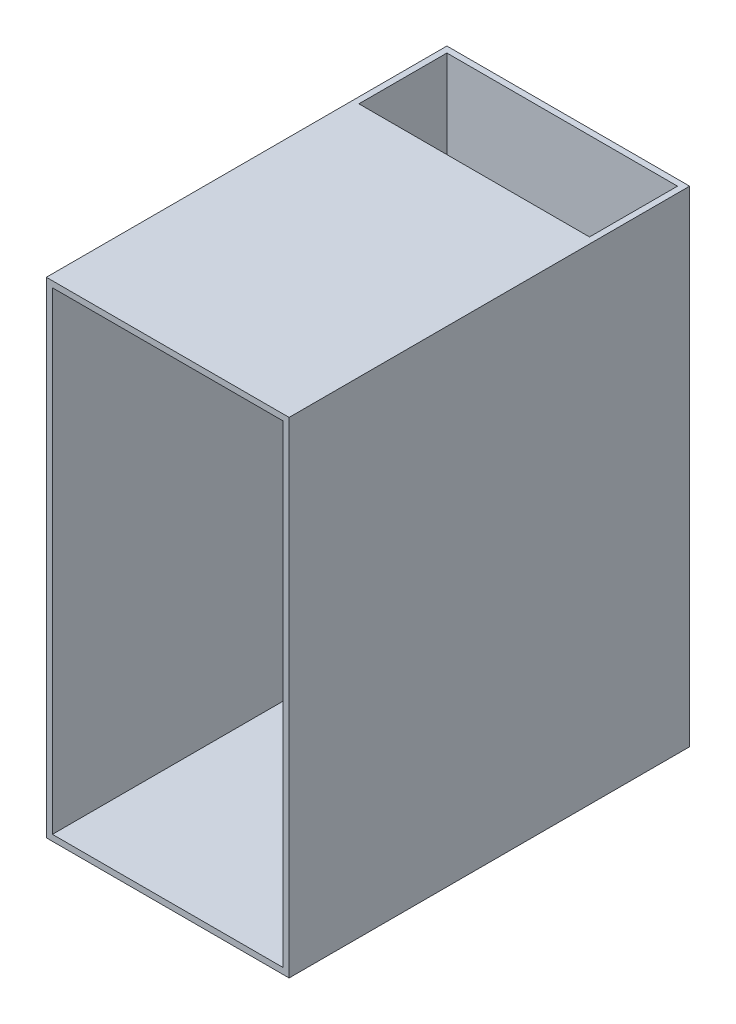
ISO-10303-21;
HEADER;
FILE_DESCRIPTION(('STEP AP214'),'2;1');
FILE_NAME('part.step','',(''),(''),'','','');
FILE_SCHEMA(('AUTOMOTIVE_DESIGN { 1 0 10303 214 1 1 1 1 }'));
ENDSEC;
DATA;
#1=APPLICATION_CONTEXT('core data for automotive mechanical design processes');
#2=APPLICATION_PROTOCOL_DEFINITION('international standard','automotive_design',2000,#1);
#3=PRODUCT_CONTEXT('',#1,'mechanical');
#4=PRODUCT('Part','Part','',(#3));
#5=PRODUCT_RELATED_PRODUCT_CATEGORY('part','',(#4));
#6=PRODUCT_DEFINITION_FORMATION('','',#4);
#7=PRODUCT_DEFINITION_CONTEXT('part definition',#1,'design');
#8=PRODUCT_DEFINITION('design','',#6,#7);
#9=PRODUCT_DEFINITION_SHAPE('','',#8);
#10=(LENGTH_UNIT() NAMED_UNIT(*) SI_UNIT(.MILLI.,.METRE.));
#11=(NAMED_UNIT(*) PLANE_ANGLE_UNIT() SI_UNIT($,.RADIAN.));
#12=(NAMED_UNIT(*) SI_UNIT($,.STERADIAN.) SOLID_ANGLE_UNIT());
#13=UNCERTAINTY_MEASURE_WITH_UNIT(LENGTH_MEASURE(1.E-05),#10,'distance_accuracy_value','');
#14=(GEOMETRIC_REPRESENTATION_CONTEXT(3) GLOBAL_UNCERTAINTY_ASSIGNED_CONTEXT((#13)) GLOBAL_UNIT_ASSIGNED_CONTEXT((#10,
#11,#12)) REPRESENTATION_CONTEXT('',''));
#15=CARTESIAN_POINT('',(0.,0.,0.));
#16=DIRECTION('',(0.,0.,1.));
#17=DIRECTION('',(1.,0.,0.));
#18=AXIS2_PLACEMENT_3D('',#15,#16,#17);
#19=CARTESIAN_POINT('',(38.,78.,132.));
#20=DIRECTION('',(-1.,0.,0.));
#21=DIRECTION('',(0.,0.,1.));
#22=AXIS2_PLACEMENT_3D('',#19,#20,#21);
#23=PLANE('',#22);
#24=DIRECTION('',(0.,-1.,0.));
#25=VECTOR('',#24,1.);
#26=CARTESIAN_POINT('',(38.,-58.,20.));
#27=LINE('',#26,#25);
#28=CARTESIAN_POINT('',(38.,-65.0000000000002,20.));
#29=VERTEX_POINT('',#28);
#30=CARTESIAN_POINT('',(38.,-78.,20.));
#31=VERTEX_POINT('',#30);
#32=EDGE_CURVE('E200',#29,#31,#27,.T.);
#33=ORIENTED_EDGE('',*,*,#32,.F.);
#34=DIRECTION('',(0.,-0.707106781186544,0.707106781186551));
#35=VECTOR('',#34,1.);
#36=CARTESIAN_POINT('',(38.,-58.,12.9999999999997));
#37=LINE('',#36,#35);
#38=CARTESIAN_POINT('',(38.,-72.1453239574458,27.1453239574457));
#39=VERTEX_POINT('',#38);
#40=EDGE_CURVE('E299',#29,#39,#37,.T.);
#41=ORIENTED_EDGE('',*,*,#40,.T.);
#42=CARTESIAN_POINT('',(38.,-79.2163917693113,20.0742561455802));
#43=DIRECTION('',(-1.,0.,0.));
#44=DIRECTION('',(0.,0.,1.));
#45=AXIS2_PLACEMENT_3D('',#42,#43,#44);
#46=CIRCLE('',#45,10.);
#47=CARTESIAN_POINT('',(38.,-78.,30.));
#48=VERTEX_POINT('',#47);
#49=EDGE_CURVE('E11',#39,#48,#46,.F.);
#50=ORIENTED_EDGE('',*,*,#49,.T.);
#51=DIRECTION('',(0.,0.,-1.));
#52=VECTOR('',#51,1.);
#53=CARTESIAN_POINT('',(38.,-78.,132.));
#54=LINE('',#53,#52);
#55=CARTESIAN_POINT('',(38.,-78.,132.));
#56=VERTEX_POINT('',#55);
#57=EDGE_CURVE('E253',#56,#48,#54,.T.);
#58=ORIENTED_EDGE('',*,*,#57,.F.);
#59=DIRECTION('',(0.,1.,0.));
#60=VECTOR('',#59,1.);
#61=CARTESIAN_POINT('',(38.,78.,132.));
#62=LINE('',#61,#60);
#63=CARTESIAN_POINT('',(38.,78.,132.));
#64=VERTEX_POINT('',#63);
#65=EDGE_CURVE('E236',#56,#64,#62,.T.);
#66=ORIENTED_EDGE('',*,*,#65,.T.);
#67=DIRECTION('',(0.,0.,-1.));
#68=VECTOR('',#67,1.);
#69=CARTESIAN_POINT('',(38.,78.,132.));
#70=LINE('',#69,#68);
#71=CARTESIAN_POINT('',(38.,78.,31.));
#72=VERTEX_POINT('',#71);
#73=EDGE_CURVE('E261',#64,#72,#70,.T.);
#74=ORIENTED_EDGE('',*,*,#73,.T.);
#75=DIRECTION('',(0.,1.,0.));
#76=VECTOR('',#75,1.);
#77=CARTESIAN_POINT('',(38.,78.,31.));
#78=LINE('',#77,#76);
#79=CARTESIAN_POINT('',(38.,80.,31.));
#80=VERTEX_POINT('',#79);
#81=EDGE_CURVE('E217',#72,#80,#78,.T.);
#82=ORIENTED_EDGE('',*,*,#81,.T.);
#83=DIRECTION('',(0.,0.,-1.));
#84=VECTOR('',#83,1.);
#85=CARTESIAN_POINT('',(38.,80.,2.00000000000001));
#86=LINE('',#85,#84);
#87=CARTESIAN_POINT('',(38.,80.,2.00000000000001));
#88=VERTEX_POINT('',#87);
#89=EDGE_CURVE('E212',#80,#88,#86,.T.);
#90=ORIENTED_EDGE('',*,*,#89,.T.);
#91=DIRECTION('',(0.,1.,0.));
#92=VECTOR('',#91,1.);
#93=CARTESIAN_POINT('',(38.,78.,2.));
#94=LINE('',#93,#92);
#95=CARTESIAN_POINT('',(38.,-78.,2.));
#96=VERTEX_POINT('',#95);
#97=EDGE_CURVE('E185',#96,#88,#94,.T.);
#98=ORIENTED_EDGE('',*,*,#97,.F.);
#99=EDGE_CURVE('E246',#31,#96,#54,.T.);
#100=ORIENTED_EDGE('',*,*,#99,.F.);
#101=EDGE_LOOP('',(#33,#41,#50,#58,#66,#74,#82,#90,#98,#100));
#102=FACE_BOUND('',#101,.T.);
#103=ADVANCED_FACE('F41',(#102),#23,.T.);
#104=CARTESIAN_POINT('',(-38.,78.,132.));
#105=DIRECTION('',(1.,0.,0.));
#106=DIRECTION('',(0.,0.,-1.));
#107=AXIS2_PLACEMENT_3D('',#104,#105,#106);
#108=PLANE('',#107);
#109=DIRECTION('',(0.,0.,-1.));
#110=VECTOR('',#109,1.);
#111=CARTESIAN_POINT('',(-38.,-78.,132.));
#112=LINE('',#111,#110);
#113=CARTESIAN_POINT('',(-38.,-78.,132.));
#114=VERTEX_POINT('',#113);
#115=CARTESIAN_POINT('',(-38.,-78.,30.));
#116=VERTEX_POINT('',#115);
#117=EDGE_CURVE('E256',#114,#116,#112,.T.);
#118=ORIENTED_EDGE('',*,*,#117,.T.);
#119=CARTESIAN_POINT('',(-38.,-79.2163917693113,20.0742561455802));
#120=DIRECTION('',(1.,0.,0.));
#121=DIRECTION('',(0.,0.,-1.));
#122=AXIS2_PLACEMENT_3D('',#119,#120,#121);
#123=CIRCLE('',#122,10.);
#124=CARTESIAN_POINT('',(-38.,-72.1453239574458,27.1453239574457));
#125=VERTEX_POINT('',#124);
#126=EDGE_CURVE('E49',#116,#125,#123,.F.);
#127=ORIENTED_EDGE('',*,*,#126,.T.);
#128=DIRECTION('',(0.,0.707106781186544,-0.707106781186551));
#129=VECTOR('',#128,1.);
#130=CARTESIAN_POINT('',(-38.,-58.,12.9999999999997));
#131=LINE('',#130,#129);
#132=CARTESIAN_POINT('',(-38.,-65.0000000000002,20.));
#133=VERTEX_POINT('',#132);
#134=EDGE_CURVE('E301',#125,#133,#131,.T.);
#135=ORIENTED_EDGE('',*,*,#134,.T.);
#136=DIRECTION('',(0.,-1.,0.));
#137=VECTOR('',#136,1.);
#138=CARTESIAN_POINT('',(-38.,-58.,20.));
#139=LINE('',#138,#137);
#140=CARTESIAN_POINT('',(-38.,-78.,20.));
#141=VERTEX_POINT('',#140);
#142=EDGE_CURVE('E195',#133,#141,#139,.T.);
#143=ORIENTED_EDGE('',*,*,#142,.T.);
#144=CARTESIAN_POINT('',(-38.,-78.,2.));
#145=VERTEX_POINT('',#144);
#146=EDGE_CURVE('E190',#141,#145,#112,.T.);
#147=ORIENTED_EDGE('',*,*,#146,.T.);
#148=DIRECTION('',(0.,-1.,0.));
#149=VECTOR('',#148,1.);
#150=CARTESIAN_POINT('',(-38.,78.,2.));
#151=LINE('',#150,#149);
#152=CARTESIAN_POINT('',(-38.,80.,2.00000000000001));
#153=VERTEX_POINT('',#152);
#154=EDGE_CURVE('E248',#153,#145,#151,.T.);
#155=ORIENTED_EDGE('',*,*,#154,.F.);
#156=DIRECTION('',(0.,0.,1.));
#157=VECTOR('',#156,1.);
#158=CARTESIAN_POINT('',(-38.,80.,2.00000000000001));
#159=LINE('',#158,#157);
#160=CARTESIAN_POINT('',(-38.,80.,31.));
#161=VERTEX_POINT('',#160);
#162=EDGE_CURVE('E202',#153,#161,#159,.T.);
#163=ORIENTED_EDGE('',*,*,#162,.T.);
#164=DIRECTION('',(0.,1.,0.));
#165=VECTOR('',#164,1.);
#166=CARTESIAN_POINT('',(-38.,78.,31.));
#167=LINE('',#166,#165);
#168=CARTESIAN_POINT('',(-38.,78.,31.));
#169=VERTEX_POINT('',#168);
#170=EDGE_CURVE('E206',#169,#161,#167,.T.);
#171=ORIENTED_EDGE('',*,*,#170,.F.);
#172=DIRECTION('',(0.,0.,-1.));
#173=VECTOR('',#172,1.);
#174=CARTESIAN_POINT('',(-38.,78.,132.));
#175=LINE('',#174,#173);
#176=CARTESIAN_POINT('',(-38.,78.,132.));
#177=VERTEX_POINT('',#176);
#178=EDGE_CURVE('E258',#177,#169,#175,.T.);
#179=ORIENTED_EDGE('',*,*,#178,.F.);
#180=DIRECTION('',(0.,-1.,0.));
#181=VECTOR('',#180,1.);
#182=CARTESIAN_POINT('',(-38.,78.,132.));
#183=LINE('',#182,#181);
#184=EDGE_CURVE('E241',#177,#114,#183,.T.);
#185=ORIENTED_EDGE('',*,*,#184,.T.);
#186=EDGE_LOOP('',(#118,#127,#135,#143,#147,#155,#163,#171,#179,#185));
#187=FACE_BOUND('',#186,.T.);
#188=ADVANCED_FACE('F303',(#187),#108,.T.);
#189=CARTESIAN_POINT('',(-38.,-78.,132.));
#190=DIRECTION('',(0.,1.,0.));
#191=DIRECTION('',(0.,0.,1.));
#192=AXIS2_PLACEMENT_3D('',#189,#190,#191);
#193=PLANE('',#192);
#194=ORIENTED_EDGE('',*,*,#57,.T.);
#195=DIRECTION('',(1.,0.,0.));
#196=VECTOR('',#195,1.);
#197=CARTESIAN_POINT('',(-38.,-78.,30.));
#198=LINE('',#197,#196);
#199=EDGE_CURVE('E192',#116,#48,#198,.T.);
#200=ORIENTED_EDGE('',*,*,#199,.F.);
#201=ORIENTED_EDGE('',*,*,#117,.F.);
#202=DIRECTION('',(1.,0.,0.));
#203=VECTOR('',#202,1.);
#204=CARTESIAN_POINT('',(-38.,-78.,132.));
#205=LINE('',#204,#203);
#206=EDGE_CURVE('E244',#114,#56,#205,.T.);
#207=ORIENTED_EDGE('',*,*,#206,.T.);
#208=EDGE_LOOP('',(#194,#200,#201,#207));
#209=FACE_BOUND('',#208,.T.);
#210=ADVANCED_FACE('F314',(#209),#193,.T.);
#211=ORIENTED_EDGE('',*,*,#146,.F.);
#212=DIRECTION('',(-1.,0.,0.));
#213=VECTOR('',#212,1.);
#214=CARTESIAN_POINT('',(-38.,-78.,20.));
#215=LINE('',#214,#213);
#216=CARTESIAN_POINT('',(-31.,-78.,20.));
#217=VERTEX_POINT('',#216);
#218=EDGE_CURVE('E182',#217,#141,#215,.T.);
#219=ORIENTED_EDGE('',*,*,#218,.F.);
#220=DIRECTION('',(0.,0.,-1.));
#221=VECTOR('',#220,1.);
#222=CARTESIAN_POINT('',(-31.,-78.,20.));
#223=LINE('',#222,#221);
#224=CARTESIAN_POINT('',(-31.,-78.,2.));
#225=VERTEX_POINT('',#224);
#226=EDGE_CURVE('E164',#217,#225,#223,.T.);
#227=ORIENTED_EDGE('',*,*,#226,.T.);
#228=DIRECTION('',(1.,0.,0.));
#229=VECTOR('',#228,1.);
#230=CARTESIAN_POINT('',(-38.,-78.,2.));
#231=LINE('',#230,#229);
#232=EDGE_CURVE('E239',#145,#225,#231,.T.);
#233=ORIENTED_EDGE('',*,*,#232,.F.);
#234=EDGE_LOOP('',(#211,#219,#227,#233));
#235=FACE_BOUND('',#234,.T.);
#236=ADVANCED_FACE('F189',(#235),#193,.T.);
#237=DIRECTION('',(0.,0.,1.));
#238=VECTOR('',#237,1.);
#239=CARTESIAN_POINT('',(31.,-78.,20.));
#240=LINE('',#239,#238);
#241=CARTESIAN_POINT('',(31.,-78.,2.));
#242=VERTEX_POINT('',#241);
#243=CARTESIAN_POINT('',(31.,-78.,20.));
#244=VERTEX_POINT('',#243);
#245=EDGE_CURVE('E175',#242,#244,#240,.T.);
#246=ORIENTED_EDGE('',*,*,#245,.T.);
#247=EDGE_CURVE('E191',#31,#244,#215,.T.);
#248=ORIENTED_EDGE('',*,*,#247,.F.);
#249=ORIENTED_EDGE('',*,*,#99,.T.);
#250=EDGE_CURVE('E251',#242,#96,#231,.T.);
#251=ORIENTED_EDGE('',*,*,#250,.F.);
#252=EDGE_LOOP('',(#246,#248,#249,#251));
#253=FACE_BOUND('',#252,.T.);
#254=ADVANCED_FACE('F342',(#253),#193,.T.);
#255=CARTESIAN_POINT('',(40.,80.,2.));
#256=DIRECTION('',(-1.,0.,0.));
#257=DIRECTION('',(0.,-1.,0.));
#258=AXIS2_PLACEMENT_3D('',#255,#256,#257);
#259=PLANE('',#258);
#260=DIRECTION('',(0.,1.,0.));
#261=VECTOR('',#260,1.);
#262=CARTESIAN_POINT('',(40.,80.,0.));
#263=LINE('',#262,#261);
#264=CARTESIAN_POINT('',(40.,-80.,0.));
#265=VERTEX_POINT('',#264);
#266=CARTESIAN_POINT('',(40.,80.,0.));
#267=VERTEX_POINT('',#266);
#268=EDGE_CURVE('E276',#265,#267,#263,.T.);
#269=ORIENTED_EDGE('',*,*,#268,.T.);
#270=DIRECTION('',(0.,0.,-1.));
#271=VECTOR('',#270,1.);
#272=CARTESIAN_POINT('',(40.,80.,2.));
#273=LINE('',#272,#271);
#274=CARTESIAN_POINT('',(40.,80.,132.));
#275=VERTEX_POINT('',#274);
#276=EDGE_CURVE('E294',#275,#267,#273,.T.);
#277=ORIENTED_EDGE('',*,*,#276,.F.);
#278=DIRECTION('',(0.,1.,0.));
#279=VECTOR('',#278,1.);
#280=CARTESIAN_POINT('',(40.,80.,132.));
#281=LINE('',#280,#279);
#282=CARTESIAN_POINT('',(40.,-80.,132.));
#283=VERTEX_POINT('',#282);
#284=EDGE_CURVE('E264',#283,#275,#281,.T.);
#285=ORIENTED_EDGE('',*,*,#284,.F.);
#286=DIRECTION('',(0.,0.,-1.));
#287=VECTOR('',#286,1.);
#288=CARTESIAN_POINT('',(40.,-80.,2.));
#289=LINE('',#288,#287);
#290=EDGE_CURVE('E285',#283,#265,#289,.T.);
#291=ORIENTED_EDGE('',*,*,#290,.T.);
#292=EDGE_LOOP('',(#269,#277,#285,#291));
#293=FACE_BOUND('',#292,.T.);
#294=ADVANCED_FACE('F362',(#293),#259,.F.);
#295=CARTESIAN_POINT('',(-40.,80.,2.));
#296=DIRECTION('',(0.,-1.,0.));
#297=DIRECTION('',(0.,0.,-1.));
#298=AXIS2_PLACEMENT_3D('',#295,#296,#297);
#299=PLANE('',#298);
#300=DIRECTION('',(1.,0.,0.));
#301=VECTOR('',#300,1.);
#302=CARTESIAN_POINT('',(-38.,80.,31.));
#303=LINE('',#302,#301);
#304=EDGE_CURVE('E209',#161,#80,#303,.T.);
#305=ORIENTED_EDGE('',*,*,#304,.F.);
#306=ORIENTED_EDGE('',*,*,#162,.F.);
#307=DIRECTION('',(-1.,0.,0.));
#308=VECTOR('',#307,1.);
#309=CARTESIAN_POINT('',(-38.,80.,2.00000000000001));
#310=LINE('',#309,#308);
#311=EDGE_CURVE('E207',#88,#153,#310,.T.);
#312=ORIENTED_EDGE('',*,*,#311,.F.);
#313=ORIENTED_EDGE('',*,*,#89,.F.);
#314=EDGE_LOOP('',(#305,#306,#312,#313));
#315=FACE_BOUND('',#314,.T.);
#316=DIRECTION('',(-1.,0.,0.));
#317=VECTOR('',#316,1.);
#318=CARTESIAN_POINT('',(-40.,80.,0.));
#319=LINE('',#318,#317);
#320=CARTESIAN_POINT('',(-40.,80.,0.));
#321=VERTEX_POINT('',#320);
#322=EDGE_CURVE('E279',#267,#321,#319,.T.);
#323=ORIENTED_EDGE('',*,*,#322,.T.);
#324=DIRECTION('',(0.,0.,-1.));
#325=VECTOR('',#324,1.);
#326=CARTESIAN_POINT('',(-40.,80.,2.));
#327=LINE('',#326,#325);
#328=CARTESIAN_POINT('',(-40.,80.,132.));
#329=VERTEX_POINT('',#328);
#330=EDGE_CURVE('E291',#329,#321,#327,.T.);
#331=ORIENTED_EDGE('',*,*,#330,.F.);
#332=DIRECTION('',(-1.,0.,0.));
#333=VECTOR('',#332,1.);
#334=CARTESIAN_POINT('',(-40.,80.,132.));
#335=LINE('',#334,#333);
#336=EDGE_CURVE('E267',#275,#329,#335,.T.);
#337=ORIENTED_EDGE('',*,*,#336,.F.);
#338=ORIENTED_EDGE('',*,*,#276,.T.);
#339=EDGE_LOOP('',(#323,#331,#337,#338));
#340=FACE_BOUND('',#339,.T.);
#341=ADVANCED_FACE('F334',(#315,#340),#299,.F.);
#342=CARTESIAN_POINT('',(-40.,80.,2.));
#343=DIRECTION('',(1.,0.,0.));
#344=DIRECTION('',(0.,1.,0.));
#345=AXIS2_PLACEMENT_3D('',#342,#343,#344);
#346=PLANE('',#345);
#347=DIRECTION('',(0.,-1.,0.));
#348=VECTOR('',#347,1.);
#349=CARTESIAN_POINT('',(-40.,80.,0.));
#350=LINE('',#349,#348);
#351=CARTESIAN_POINT('',(-40.,-80.,0.));
#352=VERTEX_POINT('',#351);
#353=EDGE_CURVE('E281',#321,#352,#350,.T.);
#354=ORIENTED_EDGE('',*,*,#353,.T.);
#355=DIRECTION('',(0.,0.,-1.));
#356=VECTOR('',#355,1.);
#357=CARTESIAN_POINT('',(-40.,-80.,2.));
#358=LINE('',#357,#356);
#359=CARTESIAN_POINT('',(-40.,-80.,132.));
#360=VERTEX_POINT('',#359);
#361=EDGE_CURVE('E288',#360,#352,#358,.T.);
#362=ORIENTED_EDGE('',*,*,#361,.F.);
#363=DIRECTION('',(0.,-1.,0.));
#364=VECTOR('',#363,1.);
#365=CARTESIAN_POINT('',(-40.,80.,132.));
#366=LINE('',#365,#364);
#367=EDGE_CURVE('E270',#329,#360,#366,.T.);
#368=ORIENTED_EDGE('',*,*,#367,.F.);
#369=ORIENTED_EDGE('',*,*,#330,.T.);
#370=EDGE_LOOP('',(#354,#362,#368,#369));
#371=FACE_BOUND('',#370,.T.);
#372=ADVANCED_FACE('F353',(#371),#346,.F.);
#373=CARTESIAN_POINT('',(-40.,-80.,2.));
#374=DIRECTION('',(0.,1.,0.));
#375=DIRECTION('',(0.,0.,1.));
#376=AXIS2_PLACEMENT_3D('',#373,#374,#375);
#377=PLANE('',#376);
#378=DIRECTION('',(1.,0.,0.));
#379=VECTOR('',#378,1.);
#380=CARTESIAN_POINT('',(-31.,-80.,2.));
#381=LINE('',#380,#379);
#382=CARTESIAN_POINT('',(-31.,-80.,2.));
#383=VERTEX_POINT('',#382);
#384=CARTESIAN_POINT('',(31.,-80.,2.));
#385=VERTEX_POINT('',#384);
#386=EDGE_CURVE('E225',#383,#385,#381,.T.);
#387=ORIENTED_EDGE('',*,*,#386,.F.);
#388=DIRECTION('',(0.,0.,-1.));
#389=VECTOR('',#388,1.);
#390=CARTESIAN_POINT('',(-31.,-80.,20.));
#391=LINE('',#390,#389);
#392=CARTESIAN_POINT('',(-31.,-80.,20.));
#393=VERTEX_POINT('',#392);
#394=EDGE_CURVE('E219',#393,#383,#391,.T.);
#395=ORIENTED_EDGE('',*,*,#394,.F.);
#396=DIRECTION('',(-1.,0.,0.));
#397=VECTOR('',#396,1.);
#398=CARTESIAN_POINT('',(-31.,-80.,20.));
#399=LINE('',#398,#397);
#400=CARTESIAN_POINT('',(31.,-80.,20.));
#401=VERTEX_POINT('',#400);
#402=EDGE_CURVE('E176',#401,#393,#399,.T.);
#403=ORIENTED_EDGE('',*,*,#402,.F.);
#404=DIRECTION('',(0.,0.,1.));
#405=VECTOR('',#404,1.);
#406=CARTESIAN_POINT('',(31.,-80.,20.));
#407=LINE('',#406,#405);
#408=EDGE_CURVE('E228',#385,#401,#407,.T.);
#409=ORIENTED_EDGE('',*,*,#408,.F.);
#410=EDGE_LOOP('',(#387,#395,#403,#409));
#411=FACE_BOUND('',#410,.T.);
#412=DIRECTION('',(1.,0.,0.));
#413=VECTOR('',#412,1.);
#414=CARTESIAN_POINT('',(-40.,-80.,0.));
#415=LINE('',#414,#413);
#416=EDGE_CURVE('E283',#352,#265,#415,.T.);
#417=ORIENTED_EDGE('',*,*,#416,.T.);
#418=ORIENTED_EDGE('',*,*,#290,.F.);
#419=DIRECTION('',(1.,0.,0.));
#420=VECTOR('',#419,1.);
#421=CARTESIAN_POINT('',(-40.,-80.,132.));
#422=LINE('',#421,#420);
#423=EDGE_CURVE('E273',#360,#283,#422,.T.);
#424=ORIENTED_EDGE('',*,*,#423,.F.);
#425=ORIENTED_EDGE('',*,*,#361,.T.);
#426=EDGE_LOOP('',(#417,#418,#424,#425));
#427=FACE_BOUND('',#426,.T.);
#428=ADVANCED_FACE('F349',(#411,#427),#377,.F.);
#429=CARTESIAN_POINT('',(0.,0.,0.));
#430=DIRECTION('',(0.,0.,1.));
#431=DIRECTION('',(1.,0.,0.));
#432=AXIS2_PLACEMENT_3D('',#429,#430,#431);
#433=PLANE('',#432);
#434=ORIENTED_EDGE('',*,*,#268,.F.);
#435=ORIENTED_EDGE('',*,*,#416,.F.);
#436=ORIENTED_EDGE('',*,*,#353,.F.);
#437=ORIENTED_EDGE('',*,*,#322,.F.);
#438=EDGE_LOOP('',(#434,#435,#436,#437));
#439=FACE_BOUND('',#438,.T.);
#440=ADVANCED_FACE('F352',(#439),#433,.F.);
#441=CARTESIAN_POINT('',(0.,0.,132.));
#442=DIRECTION('',(0.,0.,1.));
#443=DIRECTION('',(1.,0.,0.));
#444=AXIS2_PLACEMENT_3D('',#441,#442,#443);
#445=PLANE('',#444);
#446=ORIENTED_EDGE('',*,*,#284,.T.);
#447=ORIENTED_EDGE('',*,*,#336,.T.);
#448=ORIENTED_EDGE('',*,*,#367,.T.);
#449=ORIENTED_EDGE('',*,*,#423,.T.);
#450=EDGE_LOOP('',(#446,#447,#448,#449));
#451=FACE_BOUND('',#450,.T.);
#452=DIRECTION('',(-1.,0.,0.));
#453=VECTOR('',#452,1.);
#454=CARTESIAN_POINT('',(-38.,78.,132.));
#455=LINE('',#454,#453);
#456=EDGE_CURVE('E238',#64,#177,#455,.T.);
#457=ORIENTED_EDGE('',*,*,#456,.F.);
#458=ORIENTED_EDGE('',*,*,#65,.F.);
#459=ORIENTED_EDGE('',*,*,#206,.F.);
#460=ORIENTED_EDGE('',*,*,#184,.F.);
#461=EDGE_LOOP('',(#457,#458,#459,#460));
#462=FACE_BOUND('',#461,.T.);
#463=ADVANCED_FACE('F321',(#451,#462),#445,.T.);
#464=CARTESIAN_POINT('',(-38.,78.,132.));
#465=DIRECTION('',(0.,-1.,0.));
#466=DIRECTION('',(0.,0.,-1.));
#467=AXIS2_PLACEMENT_3D('',#464,#465,#466);
#468=PLANE('',#467);
#469=DIRECTION('',(1.,0.,0.));
#470=VECTOR('',#469,1.);
#471=CARTESIAN_POINT('',(-38.,78.,31.));
#472=LINE('',#471,#470);
#473=EDGE_CURVE('E203',#169,#72,#472,.T.);
#474=ORIENTED_EDGE('',*,*,#473,.T.);
#475=ORIENTED_EDGE('',*,*,#73,.F.);
#476=ORIENTED_EDGE('',*,*,#456,.T.);
#477=ORIENTED_EDGE('',*,*,#178,.T.);
#478=EDGE_LOOP('',(#474,#475,#476,#477));
#479=FACE_BOUND('',#478,.T.);
#480=ADVANCED_FACE('F324',(#479),#468,.T.);
#481=CARTESIAN_POINT('',(0.,0.,2.));
#482=DIRECTION('',(0.,0.,1.));
#483=DIRECTION('',(1.,0.,0.));
#484=AXIS2_PLACEMENT_3D('',#481,#482,#483);
#485=PLANE('',#484);
#486=ORIENTED_EDGE('',*,*,#97,.T.);
#487=ORIENTED_EDGE('',*,*,#311,.T.);
#488=ORIENTED_EDGE('',*,*,#154,.T.);
#489=ORIENTED_EDGE('',*,*,#232,.T.);
#490=DIRECTION('',(0.,-1.,0.));
#491=VECTOR('',#490,1.);
#492=CARTESIAN_POINT('',(-31.,-78.,2.));
#493=LINE('',#492,#491);
#494=EDGE_CURVE('E170',#225,#383,#493,.T.);
#495=ORIENTED_EDGE('',*,*,#494,.T.);
#496=ORIENTED_EDGE('',*,*,#386,.T.);
#497=DIRECTION('',(0.,-1.,0.));
#498=VECTOR('',#497,1.);
#499=CARTESIAN_POINT('',(31.,-78.,2.));
#500=LINE('',#499,#498);
#501=EDGE_CURVE('E233',#242,#385,#500,.T.);
#502=ORIENTED_EDGE('',*,*,#501,.F.);
#503=ORIENTED_EDGE('',*,*,#250,.T.);
#504=EDGE_LOOP('',(#486,#487,#488,#489,#495,#496,#502,#503));
#505=FACE_BOUND('',#504,.T.);
#506=ADVANCED_FACE('F337',(#505),#485,.T.);
#507=CARTESIAN_POINT('',(-31.,-78.,20.));
#508=DIRECTION('',(-1.,0.,0.));
#509=DIRECTION('',(0.,0.,1.));
#510=AXIS2_PLACEMENT_3D('',#507,#508,#509);
#511=PLANE('',#510);
#512=ORIENTED_EDGE('',*,*,#394,.T.);
#513=ORIENTED_EDGE('',*,*,#494,.F.);
#514=ORIENTED_EDGE('',*,*,#226,.F.);
#515=DIRECTION('',(0.,-1.,0.));
#516=VECTOR('',#515,1.);
#517=CARTESIAN_POINT('',(-31.,-78.,20.));
#518=LINE('',#517,#516);
#519=EDGE_CURVE('E167',#217,#393,#518,.T.);
#520=ORIENTED_EDGE('',*,*,#519,.T.);
#521=EDGE_LOOP('',(#512,#513,#514,#520));
#522=FACE_BOUND('',#521,.T.);
#523=ADVANCED_FACE('F166',(#522),#511,.F.);
#524=CARTESIAN_POINT('',(-31.,-78.,20.));
#525=DIRECTION('',(0.,0.,1.));
#526=DIRECTION('',(1.,0.,0.));
#527=AXIS2_PLACEMENT_3D('',#524,#525,#526);
#528=PLANE('',#527);
#529=ORIENTED_EDGE('',*,*,#142,.F.);
#530=DIRECTION('',(1.,0.,0.));
#531=VECTOR('',#530,1.);
#532=CARTESIAN_POINT('',(0.,-65.0000000000002,20.));
#533=LINE('',#532,#531);
#534=EDGE_CURVE('E297',#133,#29,#533,.T.);
#535=ORIENTED_EDGE('',*,*,#534,.T.);
#536=ORIENTED_EDGE('',*,*,#32,.T.);
#537=ORIENTED_EDGE('',*,*,#247,.T.);
#538=DIRECTION('',(0.,-1.,0.));
#539=VECTOR('',#538,1.);
#540=CARTESIAN_POINT('',(31.,-78.,20.));
#541=LINE('',#540,#539);
#542=EDGE_CURVE('E186',#244,#401,#541,.T.);
#543=ORIENTED_EDGE('',*,*,#542,.T.);
#544=ORIENTED_EDGE('',*,*,#402,.T.);
#545=ORIENTED_EDGE('',*,*,#519,.F.);
#546=ORIENTED_EDGE('',*,*,#218,.T.);
#547=EDGE_LOOP('',(#529,#535,#536,#537,#543,#544,#545,#546));
#548=FACE_BOUND('',#547,.T.);
#549=ADVANCED_FACE('F181',(#548),#528,.F.);
#550=CARTESIAN_POINT('',(31.,-78.,20.));
#551=DIRECTION('',(1.,0.,0.));
#552=DIRECTION('',(0.,0.,-1.));
#553=AXIS2_PLACEMENT_3D('',#550,#551,#552);
#554=PLANE('',#553);
#555=ORIENTED_EDGE('',*,*,#408,.T.);
#556=ORIENTED_EDGE('',*,*,#542,.F.);
#557=ORIENTED_EDGE('',*,*,#245,.F.);
#558=ORIENTED_EDGE('',*,*,#501,.T.);
#559=EDGE_LOOP('',(#555,#556,#557,#558));
#560=FACE_BOUND('',#559,.T.);
#561=ADVANCED_FACE('F346',(#560),#554,.F.);
#562=CARTESIAN_POINT('',(-38.,78.,31.));
#563=DIRECTION('',(0.,0.,1.));
#564=DIRECTION('',(1.,0.,0.));
#565=AXIS2_PLACEMENT_3D('',#562,#563,#564);
#566=PLANE('',#565);
#567=ORIENTED_EDGE('',*,*,#304,.T.);
#568=ORIENTED_EDGE('',*,*,#81,.F.);
#569=ORIENTED_EDGE('',*,*,#473,.F.);
#570=ORIENTED_EDGE('',*,*,#170,.T.);
#571=EDGE_LOOP('',(#567,#568,#569,#570));
#572=FACE_BOUND('',#571,.T.);
#573=ADVANCED_FACE('F327',(#572),#566,.F.);
#574=CARTESIAN_POINT('',(0.,-58.,12.9999999999997));
#575=DIRECTION('',(0.,0.707106781186551,0.707106781186544));
#576=DIRECTION('',(-1.,0.,0.));
#577=AXIS2_PLACEMENT_3D('',#574,#575,#576);
#578=PLANE('',#577);
#579=ORIENTED_EDGE('',*,*,#134,.F.);
#580=DIRECTION('',(-1.,0.,0.));
#581=VECTOR('',#580,1.);
#582=CARTESIAN_POINT('',(38.,-72.1453239574458,27.1453239574457));
#583=LINE('',#582,#581);
#584=EDGE_CURVE('E56',#125,#39,#583,.F.);
#585=ORIENTED_EDGE('',*,*,#584,.T.);
#586=ORIENTED_EDGE('',*,*,#40,.F.);
#587=ORIENTED_EDGE('',*,*,#534,.F.);
#588=EDGE_LOOP('',(#579,#585,#586,#587));
#589=FACE_BOUND('',#588,.T.);
#590=ADVANCED_FACE('F306',(#589),#578,.T.);
#591=CARTESIAN_POINT('',(-38.,-79.2163917693113,20.0742561455802));
#592=DIRECTION('',(1.,0.,0.));
#593=DIRECTION('',(0.,0.,-1.));
#594=AXIS2_PLACEMENT_3D('',#591,#592,#593);
#595=CYLINDRICAL_SURFACE('',#594,10.);
#596=ORIENTED_EDGE('',*,*,#49,.F.);
#597=ORIENTED_EDGE('',*,*,#584,.F.);
#598=ORIENTED_EDGE('',*,*,#126,.F.);
#599=ORIENTED_EDGE('',*,*,#199,.T.);
#600=EDGE_LOOP('',(#596,#597,#598,#599));
#601=FACE_BOUND('',#600,.T.);
#602=ADVANCED_FACE('F43',(#601),#595,.T.);
#603=CLOSED_SHELL('',(#103,#188,#210,#236,#254,#294,#341,#372,#428,#440,#463,#480,#506,#523,
#549,#561,#573,#590,#602));
#604=MANIFOLD_SOLID_BREP('B2',#603);
#605=ADVANCED_BREP_SHAPE_REPRESENTATION('',(#18,#604),#14);
#606=SHAPE_DEFINITION_REPRESENTATION(#9,#605);
ENDSEC;
END-ISO-10303-21;
